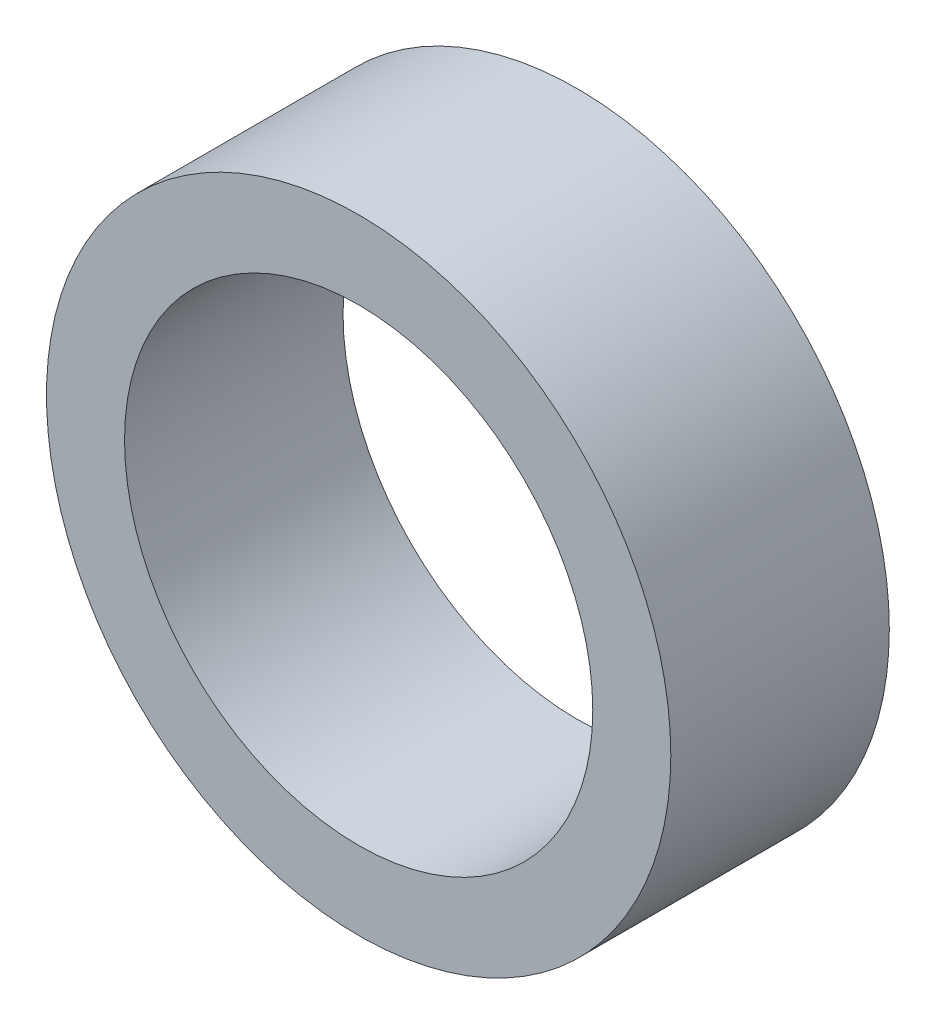
ISO-10303-21;
HEADER;
FILE_DESCRIPTION(('STEP AP214'),'2;1');
FILE_NAME('part.step','',(''),(''),'','','');
FILE_SCHEMA(('AUTOMOTIVE_DESIGN { 1 0 10303 214 1 1 1 1 }'));
ENDSEC;
DATA;
#1=APPLICATION_CONTEXT('core data for automotive mechanical design processes');
#2=APPLICATION_PROTOCOL_DEFINITION('international standard','automotive_design',2000,#1);
#3=PRODUCT_CONTEXT('',#1,'mechanical');
#4=PRODUCT('Part','Part','',(#3));
#5=PRODUCT_RELATED_PRODUCT_CATEGORY('part','',(#4));
#6=PRODUCT_DEFINITION_FORMATION('','',#4);
#7=PRODUCT_DEFINITION_CONTEXT('part definition',#1,'design');
#8=PRODUCT_DEFINITION('design','',#6,#7);
#9=PRODUCT_DEFINITION_SHAPE('','',#8);
#10=(LENGTH_UNIT() NAMED_UNIT(*) SI_UNIT(.MILLI.,.METRE.));
#11=(NAMED_UNIT(*) PLANE_ANGLE_UNIT() SI_UNIT($,.RADIAN.));
#12=(NAMED_UNIT(*) SI_UNIT($,.STERADIAN.) SOLID_ANGLE_UNIT());
#13=UNCERTAINTY_MEASURE_WITH_UNIT(LENGTH_MEASURE(1.E-05),#10,'distance_accuracy_value','');
#14=(GEOMETRIC_REPRESENTATION_CONTEXT(3) GLOBAL_UNCERTAINTY_ASSIGNED_CONTEXT((#13)) GLOBAL_UNIT_ASSIGNED_CONTEXT((#10,
#11,#12)) REPRESENTATION_CONTEXT('',''));
#15=CARTESIAN_POINT('',(0.,0.,0.));
#16=DIRECTION('',(0.,0.,1.));
#17=DIRECTION('',(1.,0.,0.));
#18=AXIS2_PLACEMENT_3D('',#15,#16,#17);
#19=CARTESIAN_POINT('',(-20.,-9.99999999999999,2.8));
#20=DIRECTION('',(0.,0.,1.));
#21=DIRECTION('',(1.,0.,0.));
#22=AXIS2_PLACEMENT_3D('',#19,#20,#21);
#23=PLANE('',#22);
#24=CARTESIAN_POINT('',(-20.,-9.99999999999999,2.8));
#25=DIRECTION('',(0.,0.,1.));
#26=DIRECTION('',(1.,0.,0.));
#27=AXIS2_PLACEMENT_3D('',#24,#25,#26);
#28=CIRCLE('',#27,4.);
#29=CARTESIAN_POINT('',(-16.,-9.99999999999999,2.8));
#30=VERTEX_POINT('',#29);
#31=EDGE_CURVE('E10',#30,#30,#28,.T.);
#32=ORIENTED_EDGE('',*,*,#31,.T.);
#33=EDGE_LOOP('',(#32));
#34=FACE_BOUND('',#33,.T.);
#35=CARTESIAN_POINT('',(-20.,-9.99999999999999,2.8));
#36=DIRECTION('',(0.,0.,1.));
#37=DIRECTION('',(1.,0.,0.));
#38=AXIS2_PLACEMENT_3D('',#35,#36,#37);
#39=CIRCLE('',#38,3.);
#40=CARTESIAN_POINT('',(-17.,-9.99999999999999,2.8));
#41=VERTEX_POINT('',#40);
#42=EDGE_CURVE('E42',#41,#41,#39,.T.);
#43=ORIENTED_EDGE('',*,*,#42,.F.);
#44=EDGE_LOOP('',(#43));
#45=FACE_BOUND('',#44,.T.);
#46=ADVANCED_FACE('F31',(#34,#45),#23,.T.);
#47=CARTESIAN_POINT('',(-20.,-9.99999999999999,0.));
#48=DIRECTION('',(0.,0.,1.));
#49=DIRECTION('',(1.,0.,0.));
#50=AXIS2_PLACEMENT_3D('',#47,#48,#49);
#51=PLANE('',#50);
#52=CARTESIAN_POINT('',(-20.,-9.99999999999999,0.));
#53=DIRECTION('',(0.,0.,1.));
#54=DIRECTION('',(1.,0.,0.));
#55=AXIS2_PLACEMENT_3D('',#52,#53,#54);
#56=CIRCLE('',#55,4.);
#57=CARTESIAN_POINT('',(-16.,-9.99999999999999,0.));
#58=VERTEX_POINT('',#57);
#59=EDGE_CURVE('E35',#58,#58,#56,.T.);
#60=ORIENTED_EDGE('',*,*,#59,.F.);
#61=EDGE_LOOP('',(#60));
#62=FACE_BOUND('',#61,.T.);
#63=CARTESIAN_POINT('',(-20.,-9.99999999999999,0.));
#64=DIRECTION('',(0.,0.,1.));
#65=DIRECTION('',(1.,0.,0.));
#66=AXIS2_PLACEMENT_3D('',#63,#64,#65);
#67=CIRCLE('',#66,3.);
#68=CARTESIAN_POINT('',(-17.,-9.99999999999999,0.));
#69=VERTEX_POINT('',#68);
#70=EDGE_CURVE('E44',#69,#69,#67,.T.);
#71=ORIENTED_EDGE('',*,*,#70,.T.);
#72=EDGE_LOOP('',(#71));
#73=FACE_BOUND('',#72,.T.);
#74=ADVANCED_FACE('F54',(#62,#73),#51,.F.);
#75=CARTESIAN_POINT('',(-20.,-9.99999999999999,2.8));
#76=DIRECTION('',(0.,0.,-1.));
#77=DIRECTION('',(-1.,0.,0.));
#78=AXIS2_PLACEMENT_3D('',#75,#76,#77);
#79=CYLINDRICAL_SURFACE('',#78,4.);
#80=ORIENTED_EDGE('',*,*,#31,.F.);
#81=EDGE_LOOP('',(#80));
#82=FACE_BOUND('',#81,.T.);
#83=ORIENTED_EDGE('',*,*,#59,.T.);
#84=EDGE_LOOP('',(#83));
#85=FACE_BOUND('',#84,.T.);
#86=ADVANCED_FACE('F33',(#82,#85),#79,.T.);
#87=CARTESIAN_POINT('',(-20.,-9.99999999999999,2.8));
#88=DIRECTION('',(0.,0.,-1.));
#89=DIRECTION('',(-1.,0.,0.));
#90=AXIS2_PLACEMENT_3D('',#87,#88,#89);
#91=CYLINDRICAL_SURFACE('',#90,3.);
#92=ORIENTED_EDGE('',*,*,#42,.T.);
#93=EDGE_LOOP('',(#92));
#94=FACE_BOUND('',#93,.T.);
#95=ORIENTED_EDGE('',*,*,#70,.F.);
#96=EDGE_LOOP('',(#95));
#97=FACE_BOUND('',#96,.T.);
#98=ADVANCED_FACE('F50',(#94,#97),#91,.F.);
#99=CLOSED_SHELL('',(#46,#74,#86,#98));
#100=MANIFOLD_SOLID_BREP('B2',#99);
#101=ADVANCED_BREP_SHAPE_REPRESENTATION('',(#18,#100),#14);
#102=SHAPE_DEFINITION_REPRESENTATION(#9,#101);
ENDSEC;
END-ISO-10303-21;
